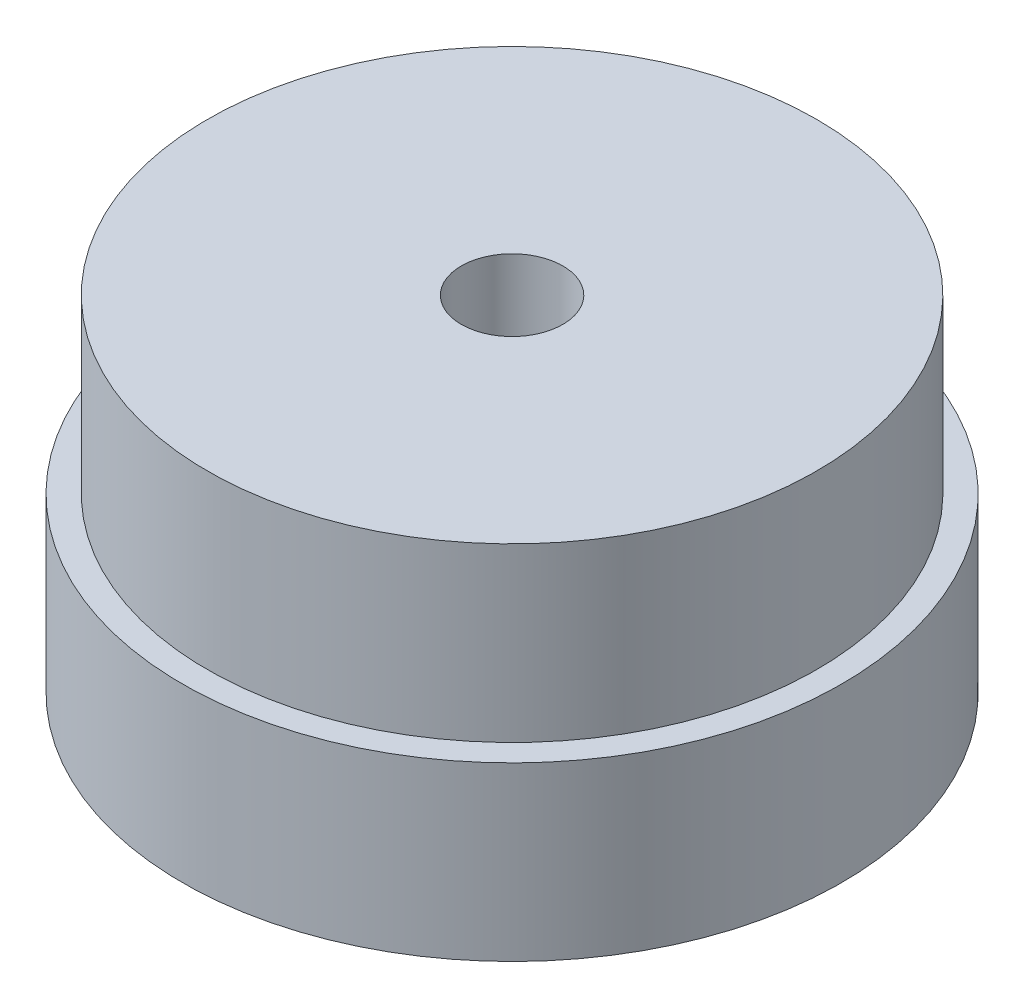
ISO-10303-21;
HEADER;
FILE_DESCRIPTION(('STEP AP214'),'2;1');
FILE_NAME('part.step','',(''),(''),'','','');
FILE_SCHEMA(('AUTOMOTIVE_DESIGN { 1 0 10303 214 1 1 1 1 }'));
ENDSEC;
DATA;
#1=APPLICATION_CONTEXT('core data for automotive mechanical design processes');
#2=APPLICATION_PROTOCOL_DEFINITION('international standard','automotive_design',2000,#1);
#3=PRODUCT_CONTEXT('',#1,'mechanical');
#4=PRODUCT('Part','Part','',(#3));
#5=PRODUCT_RELATED_PRODUCT_CATEGORY('part','',(#4));
#6=PRODUCT_DEFINITION_FORMATION('','',#4);
#7=PRODUCT_DEFINITION_CONTEXT('part definition',#1,'design');
#8=PRODUCT_DEFINITION('design','',#6,#7);
#9=PRODUCT_DEFINITION_SHAPE('','',#8);
#10=(LENGTH_UNIT() NAMED_UNIT(*) SI_UNIT(.MILLI.,.METRE.));
#11=(NAMED_UNIT(*) PLANE_ANGLE_UNIT() SI_UNIT($,.RADIAN.));
#12=(NAMED_UNIT(*) SI_UNIT($,.STERADIAN.) SOLID_ANGLE_UNIT());
#13=UNCERTAINTY_MEASURE_WITH_UNIT(LENGTH_MEASURE(1.E-05),#10,'distance_accuracy_value','');
#14=(GEOMETRIC_REPRESENTATION_CONTEXT(3) GLOBAL_UNCERTAINTY_ASSIGNED_CONTEXT((#13)) GLOBAL_UNIT_ASSIGNED_CONTEXT((#10,
#11,#12)) REPRESENTATION_CONTEXT('',''));
#15=CARTESIAN_POINT('',(0.,0.,0.));
#16=DIRECTION('',(0.,0.,1.));
#17=DIRECTION('',(1.,0.,0.));
#18=AXIS2_PLACEMENT_3D('',#15,#16,#17);
#19=CARTESIAN_POINT('',(16.5,0.,0.));
#20=DIRECTION('',(0.,-1.,0.));
#21=DIRECTION('',(0.,0.,-1.));
#22=AXIS2_PLACEMENT_3D('',#19,#20,#21);
#23=PLANE('',#22);
#24=CARTESIAN_POINT('',(0.,0.,0.));
#25=DIRECTION('',(0.,-1.,0.));
#26=DIRECTION('',(0.,0.,-1.));
#27=AXIS2_PLACEMENT_3D('',#24,#25,#26);
#28=CIRCLE('',#27,2.794);
#29=CARTESIAN_POINT('',(0.,0.,-2.794));
#30=VERTEX_POINT('',#29);
#31=EDGE_CURVE('E64',#30,#30,#28,.F.);
#32=ORIENTED_EDGE('',*,*,#31,.F.);
#33=EDGE_LOOP('',(#32));
#34=FACE_BOUND('',#33,.T.);
#35=CARTESIAN_POINT('',(0.,0.,0.));
#36=DIRECTION('',(0.,1.,0.));
#37=DIRECTION('',(0.,0.,1.));
#38=AXIS2_PLACEMENT_3D('',#35,#36,#37);
#39=CIRCLE('',#38,2.54);
#40=CARTESIAN_POINT('',(0.,0.,2.54));
#41=VERTEX_POINT('',#40);
#42=EDGE_CURVE('E57',#41,#41,#39,.T.);
#43=ORIENTED_EDGE('',*,*,#42,.T.);
#44=EDGE_LOOP('',(#43));
#45=FACE_BOUND('',#44,.T.);
#46=ADVANCED_FACE('F37',(#34,#45),#23,.T.);
#47=CARTESIAN_POINT('',(0.,0.,0.));
#48=DIRECTION('',(0.,-1.,0.));
#49=DIRECTION('',(0.,0.,-1.));
#50=AXIS2_PLACEMENT_3D('',#47,#48,#49);
#51=CIRCLE('',#50,16.246);
#52=CARTESIAN_POINT('',(0.,0.,-16.246));
#53=VERTEX_POINT('',#52);
#54=EDGE_CURVE('E67',#53,#53,#51,.T.);
#55=ORIENTED_EDGE('',*,*,#54,.F.);
#56=EDGE_LOOP('',(#55));
#57=FACE_BOUND('',#56,.T.);
#58=CARTESIAN_POINT('',(0.,0.,0.));
#59=DIRECTION('',(0.,-1.,0.));
#60=DIRECTION('',(0.,0.,-1.));
#61=AXIS2_PLACEMENT_3D('',#58,#59,#60);
#62=CIRCLE('',#61,16.5);
#63=CARTESIAN_POINT('',(0.,0.,-16.5));
#64=VERTEX_POINT('',#63);
#65=EDGE_CURVE('E52',#64,#64,#62,.T.);
#66=ORIENTED_EDGE('',*,*,#65,.T.);
#67=EDGE_LOOP('',(#66));
#68=FACE_BOUND('',#67,.T.);
#69=ADVANCED_FACE('F39',(#57,#68),#23,.T.);
#70=CARTESIAN_POINT('',(0.,17.2248271556769,0.));
#71=DIRECTION('',(0.,1.,0.));
#72=DIRECTION('',(0.,0.,1.));
#73=AXIS2_PLACEMENT_3D('',#70,#71,#72);
#74=PLANE('',#73);
#75=CARTESIAN_POINT('',(0.,17.2248271556769,0.));
#76=DIRECTION('',(0.,1.,0.));
#77=DIRECTION('',(0.,0.,1.));
#78=AXIS2_PLACEMENT_3D('',#75,#76,#77);
#79=CIRCLE('',#78,2.54);
#80=CARTESIAN_POINT('',(0.,17.2248271556769,2.54));
#81=VERTEX_POINT('',#80);
#82=EDGE_CURVE('E58',#81,#81,#79,.T.);
#83=ORIENTED_EDGE('',*,*,#82,.F.);
#84=EDGE_LOOP('',(#83));
#85=FACE_BOUND('',#84,.T.);
#86=CARTESIAN_POINT('',(0.,17.2248271556769,0.));
#87=DIRECTION('',(0.,-1.,0.));
#88=DIRECTION('',(0.,0.,-1.));
#89=AXIS2_PLACEMENT_3D('',#86,#87,#88);
#90=CIRCLE('',#89,15.25);
#91=CARTESIAN_POINT('',(0.,17.2248271556769,-15.25));
#92=VERTEX_POINT('',#91);
#93=EDGE_CURVE('E10',#92,#92,#90,.T.);
#94=ORIENTED_EDGE('',*,*,#93,.F.);
#95=EDGE_LOOP('',(#94));
#96=FACE_BOUND('',#95,.T.);
#97=ADVANCED_FACE('F102',(#85,#96),#74,.T.);
#98=CARTESIAN_POINT('',(0.,0.,0.));
#99=DIRECTION('',(0.,-1.,0.));
#100=DIRECTION('',(0.,0.,-1.));
#101=AXIS2_PLACEMENT_3D('',#98,#99,#100);
#102=CYLINDRICAL_SURFACE('',#101,15.25);
#103=ORIENTED_EDGE('',*,*,#93,.T.);
#104=EDGE_LOOP('',(#103));
#105=FACE_BOUND('',#104,.T.);
#106=CARTESIAN_POINT('',(0.,8.61241357783847,0.));
#107=DIRECTION('',(0.,-1.,0.));
#108=DIRECTION('',(0.,0.,-1.));
#109=AXIS2_PLACEMENT_3D('',#106,#107,#108);
#110=CIRCLE('',#109,15.25);
#111=CARTESIAN_POINT('',(0.,8.61241357783847,-15.25));
#112=VERTEX_POINT('',#111);
#113=EDGE_CURVE('E44',#112,#112,#110,.T.);
#114=ORIENTED_EDGE('',*,*,#113,.F.);
#115=EDGE_LOOP('',(#114));
#116=FACE_BOUND('',#115,.T.);
#117=ADVANCED_FACE('F116',(#105,#116),#102,.T.);
#118=CARTESIAN_POINT('',(15.25,8.61241357783847,0.));
#119=DIRECTION('',(0.,1.,0.));
#120=DIRECTION('',(0.,0.,1.));
#121=AXIS2_PLACEMENT_3D('',#118,#119,#120);
#122=PLANE('',#121);
#123=ORIENTED_EDGE('',*,*,#113,.T.);
#124=EDGE_LOOP('',(#123));
#125=FACE_BOUND('',#124,.T.);
#126=CARTESIAN_POINT('',(0.,8.61241357783847,0.));
#127=DIRECTION('',(0.,-1.,0.));
#128=DIRECTION('',(0.,0.,-1.));
#129=AXIS2_PLACEMENT_3D('',#126,#127,#128);
#130=CIRCLE('',#129,16.5);
#131=CARTESIAN_POINT('',(0.,8.61241357783847,-16.5));
#132=VERTEX_POINT('',#131);
#133=EDGE_CURVE('E48',#132,#132,#130,.T.);
#134=ORIENTED_EDGE('',*,*,#133,.F.);
#135=EDGE_LOOP('',(#134));
#136=FACE_BOUND('',#135,.T.);
#137=ADVANCED_FACE('F120',(#125,#136),#122,.T.);
#138=CARTESIAN_POINT('',(0.,0.,0.));
#139=DIRECTION('',(0.,-1.,0.));
#140=DIRECTION('',(0.,0.,-1.));
#141=AXIS2_PLACEMENT_3D('',#138,#139,#140);
#142=CYLINDRICAL_SURFACE('',#141,16.5);
#143=ORIENTED_EDGE('',*,*,#133,.T.);
#144=EDGE_LOOP('',(#143));
#145=FACE_BOUND('',#144,.T.);
#146=ORIENTED_EDGE('',*,*,#65,.F.);
#147=EDGE_LOOP('',(#146));
#148=FACE_BOUND('',#147,.T.);
#149=ADVANCED_FACE('F111',(#145,#148),#142,.T.);
#150=CARTESIAN_POINT('',(0.,0.,0.));
#151=DIRECTION('',(0.,1.,0.));
#152=DIRECTION('',(0.,0.,1.));
#153=AXIS2_PLACEMENT_3D('',#150,#151,#152);
#154=CYLINDRICAL_SURFACE('',#153,2.54);
#155=ORIENTED_EDGE('',*,*,#42,.F.);
#156=EDGE_LOOP('',(#155));
#157=FACE_BOUND('',#156,.T.);
#158=ORIENTED_EDGE('',*,*,#82,.T.);
#159=EDGE_LOOP('',(#158));
#160=FACE_BOUND('',#159,.T.);
#161=ADVANCED_FACE('F108',(#157,#160),#154,.F.);
#162=CARTESIAN_POINT('',(0.,16.9708271556769,0.));
#163=DIRECTION('',(0.,1.,0.));
#164=DIRECTION('',(0.,0.,1.));
#165=AXIS2_PLACEMENT_3D('',#162,#163,#164);
#166=PLANE('',#165);
#167=CARTESIAN_POINT('',(0.,16.9708271556769,0.));
#168=DIRECTION('',(0.,1.,0.));
#169=DIRECTION('',(0.,0.,1.));
#170=AXIS2_PLACEMENT_3D('',#167,#168,#169);
#171=CIRCLE('',#170,2.794);
#172=CARTESIAN_POINT('',(0.,16.9708271556769,2.794));
#173=VERTEX_POINT('',#172);
#174=EDGE_CURVE('E68',#173,#173,#171,.T.);
#175=ORIENTED_EDGE('',*,*,#174,.T.);
#176=EDGE_LOOP('',(#175));
#177=FACE_BOUND('',#176,.T.);
#178=CARTESIAN_POINT('',(0.,16.9708271556769,0.));
#179=DIRECTION('',(0.,1.,0.));
#180=DIRECTION('',(0.,0.,1.));
#181=AXIS2_PLACEMENT_3D('',#178,#179,#180);
#182=CIRCLE('',#181,14.996);
#183=CARTESIAN_POINT('',(0.,16.9708271556769,14.996));
#184=VERTEX_POINT('',#183);
#185=EDGE_CURVE('E61',#184,#184,#182,.F.);
#186=ORIENTED_EDGE('',*,*,#185,.T.);
#187=EDGE_LOOP('',(#186));
#188=FACE_BOUND('',#187,.T.);
#189=ADVANCED_FACE('F82',(#177,#188),#166,.F.);
#190=CARTESIAN_POINT('',(0.,0.,0.));
#191=DIRECTION('',(0.,-1.,0.));
#192=DIRECTION('',(0.,0.,-1.));
#193=AXIS2_PLACEMENT_3D('',#190,#191,#192);
#194=CYLINDRICAL_SURFACE('',#193,14.996);
#195=ORIENTED_EDGE('',*,*,#185,.F.);
#196=EDGE_LOOP('',(#195));
#197=FACE_BOUND('',#196,.T.);
#198=CARTESIAN_POINT('',(0.,8.35841357783847,0.));
#199=DIRECTION('',(0.,1.,0.));
#200=DIRECTION('',(0.,0.,1.));
#201=AXIS2_PLACEMENT_3D('',#198,#199,#200);
#202=CIRCLE('',#201,14.996);
#203=CARTESIAN_POINT('',(0.,8.35841357783847,14.996));
#204=VERTEX_POINT('',#203);
#205=EDGE_CURVE('E74',#204,#204,#202,.F.);
#206=ORIENTED_EDGE('',*,*,#205,.T.);
#207=EDGE_LOOP('',(#206));
#208=FACE_BOUND('',#207,.T.);
#209=ADVANCED_FACE('F147',(#197,#208),#194,.F.);
#210=CARTESIAN_POINT('',(15.25,8.35841357783847,0.));
#211=DIRECTION('',(0.,1.,0.));
#212=DIRECTION('',(0.,0.,1.));
#213=AXIS2_PLACEMENT_3D('',#210,#211,#212);
#214=PLANE('',#213);
#215=ORIENTED_EDGE('',*,*,#205,.F.);
#216=EDGE_LOOP('',(#215));
#217=FACE_BOUND('',#216,.T.);
#218=CARTESIAN_POINT('',(0.,8.35841357783847,0.));
#219=DIRECTION('',(0.,1.,0.));
#220=DIRECTION('',(0.,0.,1.));
#221=AXIS2_PLACEMENT_3D('',#218,#219,#220);
#222=CIRCLE('',#221,16.246);
#223=CARTESIAN_POINT('',(0.,8.35841357783847,16.246));
#224=VERTEX_POINT('',#223);
#225=EDGE_CURVE('E71',#224,#224,#222,.F.);
#226=ORIENTED_EDGE('',*,*,#225,.T.);
#227=EDGE_LOOP('',(#226));
#228=FACE_BOUND('',#227,.T.);
#229=ADVANCED_FACE('F93',(#217,#228),#214,.F.);
#230=CARTESIAN_POINT('',(0.,0.,0.));
#231=DIRECTION('',(0.,-1.,0.));
#232=DIRECTION('',(0.,0.,-1.));
#233=AXIS2_PLACEMENT_3D('',#230,#231,#232);
#234=CYLINDRICAL_SURFACE('',#233,16.246);
#235=ORIENTED_EDGE('',*,*,#225,.F.);
#236=EDGE_LOOP('',(#235));
#237=FACE_BOUND('',#236,.T.);
#238=ORIENTED_EDGE('',*,*,#54,.T.);
#239=EDGE_LOOP('',(#238));
#240=FACE_BOUND('',#239,.T.);
#241=ADVANCED_FACE('F87',(#237,#240),#234,.F.);
#242=CARTESIAN_POINT('',(0.,0.,0.));
#243=DIRECTION('',(0.,1.,0.));
#244=DIRECTION('',(0.,0.,1.));
#245=AXIS2_PLACEMENT_3D('',#242,#243,#244);
#246=CYLINDRICAL_SURFACE('',#245,2.794);
#247=ORIENTED_EDGE('',*,*,#31,.T.);
#248=EDGE_LOOP('',(#247));
#249=FACE_BOUND('',#248,.T.);
#250=ORIENTED_EDGE('',*,*,#174,.F.);
#251=EDGE_LOOP('',(#250));
#252=FACE_BOUND('',#251,.T.);
#253=ADVANCED_FACE('F85',(#249,#252),#246,.T.);
#254=CLOSED_SHELL('',(#46,#69,#97,#117,#137,#149,#161,#189,#209,#229,#241,#253));
#255=MANIFOLD_SOLID_BREP('B2',#254);
#256=ADVANCED_BREP_SHAPE_REPRESENTATION('',(#18,#255),#14);
#257=SHAPE_DEFINITION_REPRESENTATION(#9,#256);
ENDSEC;
END-ISO-10303-21;
